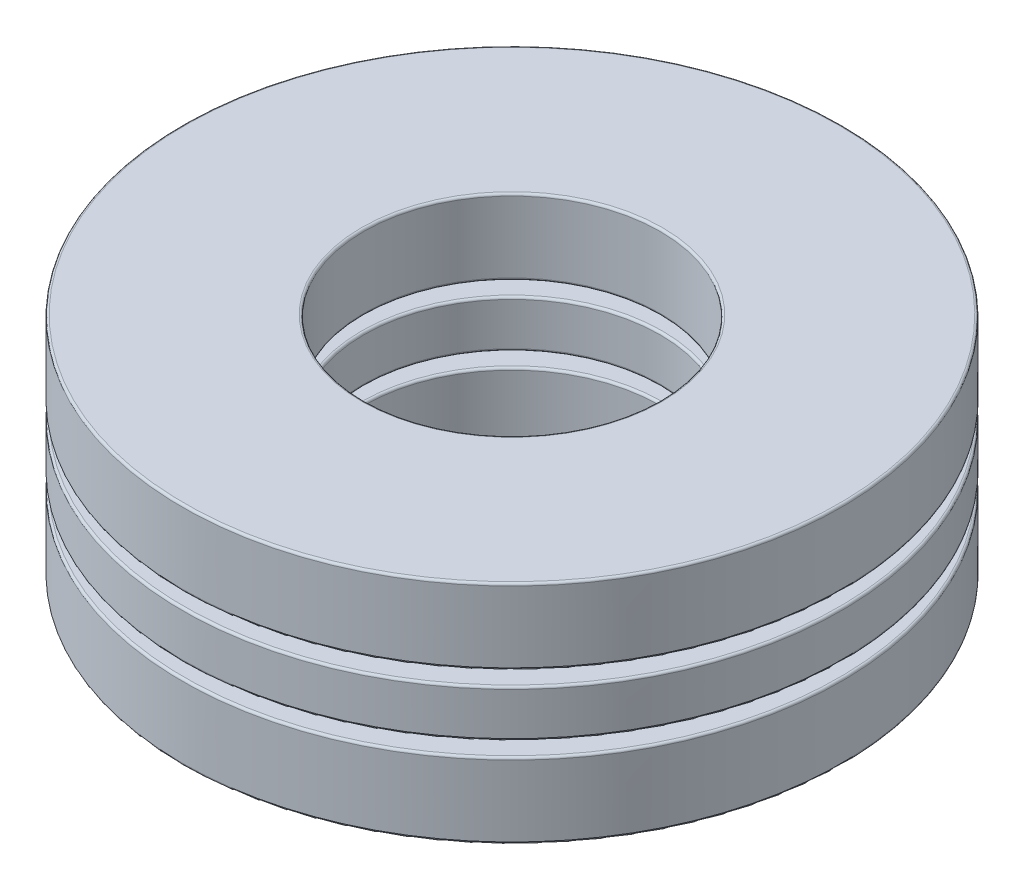
ISO-10303-21;
HEADER;
FILE_DESCRIPTION(('STEP AP214'),'2;1');
FILE_NAME('part.step','',(''),(''),'','','');
FILE_SCHEMA(('AUTOMOTIVE_DESIGN { 1 0 10303 214 1 1 1 1 }'));
ENDSEC;
DATA;
#1=APPLICATION_CONTEXT('core data for automotive mechanical design processes');
#2=APPLICATION_PROTOCOL_DEFINITION('international standard','automotive_design',2000,#1);
#3=PRODUCT_CONTEXT('',#1,'mechanical');
#4=PRODUCT('Part','Part','',(#3));
#5=PRODUCT_RELATED_PRODUCT_CATEGORY('part','',(#4));
#6=PRODUCT_DEFINITION_FORMATION('','',#4);
#7=PRODUCT_DEFINITION_CONTEXT('part definition',#1,'design');
#8=PRODUCT_DEFINITION('design','',#6,#7);
#9=PRODUCT_DEFINITION_SHAPE('','',#8);
#10=(LENGTH_UNIT() NAMED_UNIT(*) SI_UNIT(.MILLI.,.METRE.));
#11=(NAMED_UNIT(*) PLANE_ANGLE_UNIT() SI_UNIT($,.RADIAN.));
#12=(NAMED_UNIT(*) SI_UNIT($,.STERADIAN.) SOLID_ANGLE_UNIT());
#13=UNCERTAINTY_MEASURE_WITH_UNIT(LENGTH_MEASURE(1.E-05),#10,'distance_accuracy_value','');
#14=(GEOMETRIC_REPRESENTATION_CONTEXT(3) GLOBAL_UNCERTAINTY_ASSIGNED_CONTEXT((#13)) GLOBAL_UNIT_ASSIGNED_CONTEXT((#10,
#11,#12)) REPRESENTATION_CONTEXT('',''));
#15=CARTESIAN_POINT('',(0.,0.,0.));
#16=DIRECTION('',(0.,0.,1.));
#17=DIRECTION('',(1.,0.,0.));
#18=AXIS2_PLACEMENT_3D('',#15,#16,#17);
#19=CARTESIAN_POINT('',(0.,-2.4511,0.));
#20=DIRECTION('',(0.,-1.,0.));
#21=DIRECTION('',(0.,0.,-1.));
#22=AXIS2_PLACEMENT_3D('',#19,#20,#21);
#23=CYLINDRICAL_SURFACE('',#22,7.14375);
#24=CARTESIAN_POINT('',(0.,-2.402078,0.));
#25=DIRECTION('',(0.,1.,0.));
#26=DIRECTION('',(0.,0.,1.));
#27=AXIS2_PLACEMENT_3D('',#24,#25,#26);
#28=CIRCLE('',#27,7.14375);
#29=CARTESIAN_POINT('',(0.,-2.402078,7.14375));
#30=VERTEX_POINT('',#29);
#31=EDGE_CURVE('E11',#30,#30,#28,.T.);
#32=ORIENTED_EDGE('',*,*,#31,.T.);
#33=EDGE_LOOP('',(#32));
#34=FACE_BOUND('',#33,.T.);
#35=CARTESIAN_POINT('',(0.,-0.866055333333333,0.));
#36=DIRECTION('',(0.,-1.,0.));
#37=DIRECTION('',(0.,0.,-1.));
#38=AXIS2_PLACEMENT_3D('',#35,#36,#37);
#39=CIRCLE('',#38,7.14375);
#40=CARTESIAN_POINT('',(0.,-0.866055333333333,-7.14375));
#41=VERTEX_POINT('',#40);
#42=EDGE_CURVE('E52',#41,#41,#39,.T.);
#43=ORIENTED_EDGE('',*,*,#42,.T.);
#44=EDGE_LOOP('',(#43));
#45=FACE_BOUND('',#44,.T.);
#46=ADVANCED_FACE('F45',(#34,#45),#23,.T.);
#47=CARTESIAN_POINT('',(0.,-0.817033333333333,7.14375));
#48=DIRECTION('',(0.,-1.,0.));
#49=DIRECTION('',(0.,0.,-1.));
#50=AXIS2_PLACEMENT_3D('',#47,#48,#49);
#51=PLANE('',#50);
#52=CARTESIAN_POINT('',(0.,-0.817033333333333,0.));
#53=DIRECTION('',(0.,-1.,0.));
#54=DIRECTION('',(0.,0.,-1.));
#55=AXIS2_PLACEMENT_3D('',#52,#53,#54);
#56=CIRCLE('',#55,3.262122);
#57=CARTESIAN_POINT('',(0.,-0.817033333333333,-3.262122));
#58=VERTEX_POINT('',#57);
#59=EDGE_CURVE('E56',#58,#58,#56,.T.);
#60=ORIENTED_EDGE('',*,*,#59,.T.);
#61=EDGE_LOOP('',(#60));
#62=FACE_BOUND('',#61,.T.);
#63=CARTESIAN_POINT('',(0.,-0.817033333333333,0.));
#64=DIRECTION('',(0.,-1.,0.));
#65=DIRECTION('',(0.,0.,-1.));
#66=AXIS2_PLACEMENT_3D('',#63,#64,#65);
#67=CIRCLE('',#66,7.094728);
#68=CARTESIAN_POINT('',(0.,-0.817033333333333,-7.094728));
#69=VERTEX_POINT('',#68);
#70=EDGE_CURVE('E60',#69,#69,#67,.F.);
#71=ORIENTED_EDGE('',*,*,#70,.T.);
#72=EDGE_LOOP('',(#71));
#73=FACE_BOUND('',#72,.T.);
#74=ADVANCED_FACE('F88',(#62,#73),#51,.F.);
#75=CARTESIAN_POINT('',(0.,-2.4511,0.));
#76=DIRECTION('',(0.,-1.,0.));
#77=DIRECTION('',(0.,0.,-1.));
#78=AXIS2_PLACEMENT_3D('',#75,#76,#77);
#79=CYLINDRICAL_SURFACE('',#78,3.2131);
#80=CARTESIAN_POINT('',(0.,-2.402078,0.));
#81=DIRECTION('',(0.,1.,0.));
#82=DIRECTION('',(0.,0.,1.));
#83=AXIS2_PLACEMENT_3D('',#80,#81,#82);
#84=CIRCLE('',#83,3.2131);
#85=CARTESIAN_POINT('',(0.,-2.402078,3.2131));
#86=VERTEX_POINT('',#85);
#87=EDGE_CURVE('E71',#86,#86,#84,.F.);
#88=ORIENTED_EDGE('',*,*,#87,.T.);
#89=EDGE_LOOP('',(#88));
#90=FACE_BOUND('',#89,.T.);
#91=CARTESIAN_POINT('',(0.,-0.866055333333333,0.));
#92=DIRECTION('',(0.,-1.,0.));
#93=DIRECTION('',(0.,0.,-1.));
#94=AXIS2_PLACEMENT_3D('',#91,#92,#93);
#95=CIRCLE('',#94,3.2131);
#96=CARTESIAN_POINT('',(0.,-0.866055333333333,-3.2131));
#97=VERTEX_POINT('',#96);
#98=EDGE_CURVE('E74',#97,#97,#95,.F.);
#99=ORIENTED_EDGE('',*,*,#98,.T.);
#100=EDGE_LOOP('',(#99));
#101=FACE_BOUND('',#100,.T.);
#102=ADVANCED_FACE('F78',(#90,#101),#79,.F.);
#103=CARTESIAN_POINT('',(0.,-2.4511,7.14375));
#104=DIRECTION('',(0.,1.,0.));
#105=DIRECTION('',(0.,0.,1.));
#106=AXIS2_PLACEMENT_3D('',#103,#104,#105);
#107=PLANE('',#106);
#108=CARTESIAN_POINT('',(0.,-2.4511,0.));
#109=DIRECTION('',(0.,1.,0.));
#110=DIRECTION('',(0.,0.,1.));
#111=AXIS2_PLACEMENT_3D('',#108,#109,#110);
#112=CIRCLE('',#111,3.262122);
#113=CARTESIAN_POINT('',(0.,-2.4511,3.262122));
#114=VERTEX_POINT('',#113);
#115=EDGE_CURVE('E65',#114,#114,#112,.T.);
#116=ORIENTED_EDGE('',*,*,#115,.T.);
#117=EDGE_LOOP('',(#116));
#118=FACE_BOUND('',#117,.T.);
#119=CARTESIAN_POINT('',(0.,-2.4511,0.));
#120=DIRECTION('',(0.,1.,0.));
#121=DIRECTION('',(0.,0.,1.));
#122=AXIS2_PLACEMENT_3D('',#119,#120,#121);
#123=CIRCLE('',#122,7.094728);
#124=CARTESIAN_POINT('',(0.,-2.4511,7.094728));
#125=VERTEX_POINT('',#124);
#126=EDGE_CURVE('E68',#125,#125,#123,.F.);
#127=ORIENTED_EDGE('',*,*,#126,.T.);
#128=EDGE_LOOP('',(#127));
#129=FACE_BOUND('',#128,.T.);
#130=ADVANCED_FACE('F107',(#118,#129),#107,.F.);
#131=CARTESIAN_POINT('',(0.,-2.402078,0.));
#132=DIRECTION('',(0.,1.,0.));
#133=DIRECTION('',(0.,0.,1.));
#134=AXIS2_PLACEMENT_3D('',#131,#132,#133);
#135=TOROIDAL_SURFACE('',#134,3.262122,0.049022);
#136=ORIENTED_EDGE('',*,*,#115,.F.);
#137=EDGE_LOOP('',(#136));
#138=FACE_BOUND('',#137,.T.);
#139=ORIENTED_EDGE('',*,*,#87,.F.);
#140=EDGE_LOOP('',(#139));
#141=FACE_BOUND('',#140,.T.);
#142=ADVANCED_FACE('F84',(#138,#141),#135,.T.);
#143=CARTESIAN_POINT('',(0.,-0.866055333333333,0.));
#144=DIRECTION('',(0.,-1.,0.));
#145=DIRECTION('',(0.,0.,-1.));
#146=AXIS2_PLACEMENT_3D('',#143,#144,#145);
#147=TOROIDAL_SURFACE('',#146,3.262122,0.049022);
#148=ORIENTED_EDGE('',*,*,#98,.F.);
#149=EDGE_LOOP('',(#148));
#150=FACE_BOUND('',#149,.T.);
#151=ORIENTED_EDGE('',*,*,#59,.F.);
#152=EDGE_LOOP('',(#151));
#153=FACE_BOUND('',#152,.T.);
#154=ADVANCED_FACE('F80',(#150,#153),#147,.T.);
#155=CARTESIAN_POINT('',(0.,-2.402078,0.));
#156=DIRECTION('',(0.,1.,0.));
#157=DIRECTION('',(0.,0.,1.));
#158=AXIS2_PLACEMENT_3D('',#155,#156,#157);
#159=TOROIDAL_SURFACE('',#158,7.094728,0.049022);
#160=ORIENTED_EDGE('',*,*,#31,.F.);
#161=EDGE_LOOP('',(#160));
#162=FACE_BOUND('',#161,.T.);
#163=ORIENTED_EDGE('',*,*,#126,.F.);
#164=EDGE_LOOP('',(#163));
#165=FACE_BOUND('',#164,.T.);
#166=ADVANCED_FACE('F83',(#162,#165),#159,.T.);
#167=CARTESIAN_POINT('',(0.,-0.866055333333333,0.));
#168=DIRECTION('',(0.,-1.,0.));
#169=DIRECTION('',(0.,0.,-1.));
#170=AXIS2_PLACEMENT_3D('',#167,#168,#169);
#171=TOROIDAL_SURFACE('',#170,7.094728,0.049022);
#172=ORIENTED_EDGE('',*,*,#70,.F.);
#173=EDGE_LOOP('',(#172));
#174=FACE_BOUND('',#173,.T.);
#175=ORIENTED_EDGE('',*,*,#42,.F.);
#176=EDGE_LOOP('',(#175));
#177=FACE_BOUND('',#176,.T.);
#178=ADVANCED_FACE('F47',(#174,#177),#171,.T.);
#179=CLOSED_SHELL('',(#46,#74,#102,#130,#142,#154,#166,#178));
#180=MANIFOLD_SOLID_BREP('B2',#179);
#181=CARTESIAN_POINT('',(0.,-2.4511,0.));
#182=DIRECTION('',(0.,-1.,0.));
#183=DIRECTION('',(0.,0.,-1.));
#184=AXIS2_PLACEMENT_3D('',#181,#182,#183);
#185=CYLINDRICAL_SURFACE('',#184,7.14375);
#186=CARTESIAN_POINT('',(0.,0.866055333333334,0.));
#187=DIRECTION('',(0.,1.,0.));
#188=DIRECTION('',(0.,0.,1.));
#189=AXIS2_PLACEMENT_3D('',#186,#187,#188);
#190=CIRCLE('',#189,7.14375);
#191=CARTESIAN_POINT('',(0.,0.866055333333334,7.14375));
#192=VERTEX_POINT('',#191);
#193=EDGE_CURVE('E44',#192,#192,#190,.T.);
#194=ORIENTED_EDGE('',*,*,#193,.T.);
#195=EDGE_LOOP('',(#194));
#196=FACE_BOUND('',#195,.T.);
#197=CARTESIAN_POINT('',(0.,2.402078,0.));
#198=DIRECTION('',(0.,-1.,0.));
#199=DIRECTION('',(0.,0.,-1.));
#200=AXIS2_PLACEMENT_3D('',#197,#198,#199);
#201=CIRCLE('',#200,7.14375);
#202=CARTESIAN_POINT('',(0.,2.402078,-7.14375));
#203=VERTEX_POINT('',#202);
#204=EDGE_CURVE('E179',#203,#203,#201,.T.);
#205=ORIENTED_EDGE('',*,*,#204,.T.);
#206=EDGE_LOOP('',(#205));
#207=FACE_BOUND('',#206,.T.);
#208=ADVANCED_FACE('F172',(#196,#207),#185,.T.);
#209=CARTESIAN_POINT('',(0.,2.4511,7.14375));
#210=DIRECTION('',(0.,-1.,0.));
#211=DIRECTION('',(0.,0.,-1.));
#212=AXIS2_PLACEMENT_3D('',#209,#210,#211);
#213=PLANE('',#212);
#214=CARTESIAN_POINT('',(0.,2.4511,0.));
#215=DIRECTION('',(0.,-1.,0.));
#216=DIRECTION('',(0.,0.,-1.));
#217=AXIS2_PLACEMENT_3D('',#214,#215,#216);
#218=CIRCLE('',#217,3.262122);
#219=CARTESIAN_POINT('',(0.,2.4511,-3.262122));
#220=VERTEX_POINT('',#219);
#221=EDGE_CURVE('E183',#220,#220,#218,.T.);
#222=ORIENTED_EDGE('',*,*,#221,.T.);
#223=EDGE_LOOP('',(#222));
#224=FACE_BOUND('',#223,.T.);
#225=CARTESIAN_POINT('',(0.,2.4511,0.));
#226=DIRECTION('',(0.,-1.,0.));
#227=DIRECTION('',(0.,0.,-1.));
#228=AXIS2_PLACEMENT_3D('',#225,#226,#227);
#229=CIRCLE('',#228,7.094728);
#230=CARTESIAN_POINT('',(0.,2.4511,-7.094728));
#231=VERTEX_POINT('',#230);
#232=EDGE_CURVE('E187',#231,#231,#229,.F.);
#233=ORIENTED_EDGE('',*,*,#232,.T.);
#234=EDGE_LOOP('',(#233));
#235=FACE_BOUND('',#234,.T.);
#236=ADVANCED_FACE('F215',(#224,#235),#213,.F.);
#237=CARTESIAN_POINT('',(0.,-2.4511,0.));
#238=DIRECTION('',(0.,-1.,0.));
#239=DIRECTION('',(0.,0.,-1.));
#240=AXIS2_PLACEMENT_3D('',#237,#238,#239);
#241=CYLINDRICAL_SURFACE('',#240,3.2131);
#242=CARTESIAN_POINT('',(0.,0.866055333333334,0.));
#243=DIRECTION('',(0.,1.,0.));
#244=DIRECTION('',(0.,0.,1.));
#245=AXIS2_PLACEMENT_3D('',#242,#243,#244);
#246=CIRCLE('',#245,3.2131);
#247=CARTESIAN_POINT('',(0.,0.866055333333334,3.2131));
#248=VERTEX_POINT('',#247);
#249=EDGE_CURVE('E198',#248,#248,#246,.F.);
#250=ORIENTED_EDGE('',*,*,#249,.T.);
#251=EDGE_LOOP('',(#250));
#252=FACE_BOUND('',#251,.T.);
#253=CARTESIAN_POINT('',(0.,2.402078,0.));
#254=DIRECTION('',(0.,-1.,0.));
#255=DIRECTION('',(0.,0.,-1.));
#256=AXIS2_PLACEMENT_3D('',#253,#254,#255);
#257=CIRCLE('',#256,3.2131);
#258=CARTESIAN_POINT('',(0.,2.402078,-3.2131));
#259=VERTEX_POINT('',#258);
#260=EDGE_CURVE('E201',#259,#259,#257,.F.);
#261=ORIENTED_EDGE('',*,*,#260,.T.);
#262=EDGE_LOOP('',(#261));
#263=FACE_BOUND('',#262,.T.);
#264=ADVANCED_FACE('F205',(#252,#263),#241,.F.);
#265=CARTESIAN_POINT('',(0.,0.817033333333334,7.14375));
#266=DIRECTION('',(0.,1.,0.));
#267=DIRECTION('',(0.,0.,1.));
#268=AXIS2_PLACEMENT_3D('',#265,#266,#267);
#269=PLANE('',#268);
#270=CARTESIAN_POINT('',(0.,0.817033333333334,0.));
#271=DIRECTION('',(0.,1.,0.));
#272=DIRECTION('',(0.,0.,1.));
#273=AXIS2_PLACEMENT_3D('',#270,#271,#272);
#274=CIRCLE('',#273,3.262122);
#275=CARTESIAN_POINT('',(0.,0.817033333333334,3.262122));
#276=VERTEX_POINT('',#275);
#277=EDGE_CURVE('E192',#276,#276,#274,.T.);
#278=ORIENTED_EDGE('',*,*,#277,.T.);
#279=EDGE_LOOP('',(#278));
#280=FACE_BOUND('',#279,.T.);
#281=CARTESIAN_POINT('',(0.,0.817033333333334,0.));
#282=DIRECTION('',(0.,1.,0.));
#283=DIRECTION('',(0.,0.,1.));
#284=AXIS2_PLACEMENT_3D('',#281,#282,#283);
#285=CIRCLE('',#284,7.094728);
#286=CARTESIAN_POINT('',(0.,0.817033333333334,7.094728));
#287=VERTEX_POINT('',#286);
#288=EDGE_CURVE('E195',#287,#287,#285,.F.);
#289=ORIENTED_EDGE('',*,*,#288,.T.);
#290=EDGE_LOOP('',(#289));
#291=FACE_BOUND('',#290,.T.);
#292=ADVANCED_FACE('F234',(#280,#291),#269,.F.);
#293=CARTESIAN_POINT('',(0.,0.866055333333334,0.));
#294=DIRECTION('',(0.,1.,0.));
#295=DIRECTION('',(0.,0.,1.));
#296=AXIS2_PLACEMENT_3D('',#293,#294,#295);
#297=TOROIDAL_SURFACE('',#296,3.262122,0.049022);
#298=ORIENTED_EDGE('',*,*,#277,.F.);
#299=EDGE_LOOP('',(#298));
#300=FACE_BOUND('',#299,.T.);
#301=ORIENTED_EDGE('',*,*,#249,.F.);
#302=EDGE_LOOP('',(#301));
#303=FACE_BOUND('',#302,.T.);
#304=ADVANCED_FACE('F211',(#300,#303),#297,.T.);
#305=CARTESIAN_POINT('',(0.,2.402078,0.));
#306=DIRECTION('',(0.,-1.,0.));
#307=DIRECTION('',(0.,0.,-1.));
#308=AXIS2_PLACEMENT_3D('',#305,#306,#307);
#309=TOROIDAL_SURFACE('',#308,3.262122,0.049022);
#310=ORIENTED_EDGE('',*,*,#260,.F.);
#311=EDGE_LOOP('',(#310));
#312=FACE_BOUND('',#311,.T.);
#313=ORIENTED_EDGE('',*,*,#221,.F.);
#314=EDGE_LOOP('',(#313));
#315=FACE_BOUND('',#314,.T.);
#316=ADVANCED_FACE('F207',(#312,#315),#309,.T.);
#317=CARTESIAN_POINT('',(0.,0.866055333333334,0.));
#318=DIRECTION('',(0.,1.,0.));
#319=DIRECTION('',(0.,0.,1.));
#320=AXIS2_PLACEMENT_3D('',#317,#318,#319);
#321=TOROIDAL_SURFACE('',#320,7.094728,0.049022);
#322=ORIENTED_EDGE('',*,*,#193,.F.);
#323=EDGE_LOOP('',(#322));
#324=FACE_BOUND('',#323,.T.);
#325=ORIENTED_EDGE('',*,*,#288,.F.);
#326=EDGE_LOOP('',(#325));
#327=FACE_BOUND('',#326,.T.);
#328=ADVANCED_FACE('F210',(#324,#327),#321,.T.);
#329=CARTESIAN_POINT('',(0.,2.402078,0.));
#330=DIRECTION('',(0.,-1.,0.));
#331=DIRECTION('',(0.,0.,-1.));
#332=AXIS2_PLACEMENT_3D('',#329,#330,#331);
#333=TOROIDAL_SURFACE('',#332,7.094728,0.049022);
#334=ORIENTED_EDGE('',*,*,#232,.F.);
#335=EDGE_LOOP('',(#334));
#336=FACE_BOUND('',#335,.T.);
#337=ORIENTED_EDGE('',*,*,#204,.F.);
#338=EDGE_LOOP('',(#337));
#339=FACE_BOUND('',#338,.T.);
#340=ADVANCED_FACE('F174',(#336,#339),#333,.T.);
#341=CLOSED_SHELL('',(#208,#236,#264,#292,#304,#316,#328,#340));
#342=MANIFOLD_SOLID_BREP('B6',#341);
#343=CARTESIAN_POINT('',(-4.48464760159246,0.,-2.58921249999996));
#344=DIRECTION('',(0.,1.,0.));
#345=DIRECTION('',(0.866025403784443,0.,0.499999999999992));
#346=AXIS2_PLACEMENT_3D('',#343,#344,#345);
#347=SPHERICAL_SURFACE('',#346,0.817033333333333);
#348=CARTESIAN_POINT('',(-4.48464760159246,0.817033333333333,-2.58921249999996));
#349=VERTEX_POINT('',#348);
#350=VERTEX_LOOP('',#349);
#351=FACE_BOUND('',#350,.T.);
#352=ADVANCED_FACE('F299',(#351),#347,.T.);
#353=CLOSED_SHELL('',(#352));
#354=MANIFOLD_SOLID_BREP('B39',#353);
#355=CARTESIAN_POINT('',(4.48464760159242,0.,-2.58921250000002));
#356=DIRECTION('',(0.,1.,0.));
#357=DIRECTION('',(-0.866025403784436,0.,0.500000000000004));
#358=AXIS2_PLACEMENT_3D('',#355,#356,#357);
#359=SPHERICAL_SURFACE('',#358,0.817033333333333);
#360=CARTESIAN_POINT('',(4.48464760159242,0.817033333333333,-2.58921250000002));
#361=VERTEX_POINT('',#360);
#362=VERTEX_LOOP('',#361);
#363=FACE_BOUND('',#362,.T.);
#364=ADVANCED_FACE('F317',(#363),#359,.T.);
#365=CLOSED_SHELL('',(#364));
#366=MANIFOLD_SOLID_BREP('B168',#365);
#367=CARTESIAN_POINT('',(0.,0.,5.178425));
#368=DIRECTION('',(0.,1.,0.));
#369=DIRECTION('',(0.,0.,-1.));
#370=AXIS2_PLACEMENT_3D('',#367,#368,#369);
#371=SPHERICAL_SURFACE('',#370,0.817033333333333);
#372=CARTESIAN_POINT('',(0.,0.817033333333333,5.178425));
#373=VERTEX_POINT('',#372);
#374=VERTEX_LOOP('',#373);
#375=FACE_BOUND('',#374,.T.);
#376=ADVANCED_FACE('F336',(#375),#371,.T.);
#377=CLOSED_SHELL('',(#376));
#378=MANIFOLD_SOLID_BREP('B295',#377);
#379=CARTESIAN_POINT('',(0.,-2.4511,0.));
#380=DIRECTION('',(0.,-1.,0.));
#381=DIRECTION('',(0.,0.,-1.));
#382=AXIS2_PLACEMENT_3D('',#379,#380,#381);
#383=CYLINDRICAL_SURFACE('',#382,7.14375);
#384=CARTESIAN_POINT('',(0.,-0.461623833333335,0.));
#385=DIRECTION('',(0.,1.,0.));
#386=DIRECTION('',(0.,0.,1.));
#387=AXIS2_PLACEMENT_3D('',#384,#385,#386);
#388=CIRCLE('',#387,7.14375);
#389=CARTESIAN_POINT('',(0.,-0.461623833333335,7.14375));
#390=VERTEX_POINT('',#389);
#391=EDGE_CURVE('E335',#390,#390,#388,.T.);
#392=ORIENTED_EDGE('',*,*,#391,.T.);
#393=EDGE_LOOP('',(#392));
#394=FACE_BOUND('',#393,.T.);
#395=CARTESIAN_POINT('',(0.,0.461623833333332,0.));
#396=DIRECTION('',(0.,-1.,0.));
#397=DIRECTION('',(0.,0.,-1.));
#398=AXIS2_PLACEMENT_3D('',#395,#396,#397);
#399=CIRCLE('',#398,7.14375);
#400=CARTESIAN_POINT('',(0.,0.461623833333332,-7.14375));
#401=VERTEX_POINT('',#400);
#402=EDGE_CURVE('E355',#401,#401,#399,.T.);
#403=ORIENTED_EDGE('',*,*,#402,.T.);
#404=EDGE_LOOP('',(#403));
#405=FACE_BOUND('',#404,.T.);
#406=ADVANCED_FACE('F348',(#394,#405),#383,.T.);
#407=CARTESIAN_POINT('',(0.,-0.510645833333335,7.14375));
#408=DIRECTION('',(0.,1.,0.));
#409=DIRECTION('',(0.,0.,1.));
#410=AXIS2_PLACEMENT_3D('',#407,#408,#409);
#411=PLANE('',#410);
#412=CARTESIAN_POINT('',(0.,-0.510645833333335,0.));
#413=DIRECTION('',(0.,1.,0.));
#414=DIRECTION('',(0.,0.,1.));
#415=AXIS2_PLACEMENT_3D('',#412,#413,#414);
#416=CIRCLE('',#415,3.262122);
#417=CARTESIAN_POINT('',(0.,-0.510645833333335,3.262122));
#418=VERTEX_POINT('',#417);
#419=EDGE_CURVE('E368',#418,#418,#416,.T.);
#420=ORIENTED_EDGE('',*,*,#419,.T.);
#421=EDGE_LOOP('',(#420));
#422=FACE_BOUND('',#421,.T.);
#423=CARTESIAN_POINT('',(0.,-0.510645833333335,0.));
#424=DIRECTION('',(0.,1.,0.));
#425=DIRECTION('',(0.,0.,1.));
#426=AXIS2_PLACEMENT_3D('',#423,#424,#425);
#427=CIRCLE('',#426,7.094728);
#428=CARTESIAN_POINT('',(0.,-0.510645833333335,7.094728));
#429=VERTEX_POINT('',#428);
#430=EDGE_CURVE('E371',#429,#429,#427,.F.);
#431=ORIENTED_EDGE('',*,*,#430,.T.);
#432=EDGE_LOOP('',(#431));
#433=FACE_BOUND('',#432,.T.);
#434=CARTESIAN_POINT('',(-4.48464760159246,-0.510645833333335,-2.58921249999996));
#435=DIRECTION('',(0.,1.,0.));
#436=DIRECTION('',(-0.866025403784443,0.,-0.499999999999992));
#437=AXIS2_PLACEMENT_3D('',#434,#435,#436);
#438=CIRCLE('',#437,0.637796441411429);
#439=CARTESIAN_POINT('',(-3.93229968088684,-0.510645833333335,-2.27031427929425));
#440=VERTEX_POINT('',#439);
#441=EDGE_CURVE('E392',#440,#440,#438,.T.);
#442=ORIENTED_EDGE('',*,*,#441,.T.);
#443=EDGE_LOOP('',(#442));
#444=FACE_BOUND('',#443,.T.);
#445=CARTESIAN_POINT('',(4.48464760159242,-0.510645833333335,-2.58921250000002));
#446=DIRECTION('',(0.,1.,0.));
#447=DIRECTION('',(0.866025403784436,0.,-0.500000000000004));
#448=AXIS2_PLACEMENT_3D('',#445,#446,#447);
#449=CIRCLE('',#448,0.637796441411429);
#450=CARTESIAN_POINT('',(3.93229968088681,-0.510645833333335,-2.2703142792943));
#451=VERTEX_POINT('',#450);
#452=EDGE_CURVE('E384',#451,#451,#449,.T.);
#453=ORIENTED_EDGE('',*,*,#452,.T.);
#454=EDGE_LOOP('',(#453));
#455=FACE_BOUND('',#454,.T.);
#456=CARTESIAN_POINT('',(0.,-0.510645833333335,5.178425));
#457=DIRECTION('',(0.,1.,0.));
#458=DIRECTION('',(0.,0.,1.));
#459=AXIS2_PLACEMENT_3D('',#456,#457,#458);
#460=CIRCLE('',#459,0.637796441411429);
#461=CARTESIAN_POINT('',(0.,-0.510645833333335,4.54062855858857));
#462=VERTEX_POINT('',#461);
#463=EDGE_CURVE('E380',#462,#462,#460,.T.);
#464=ORIENTED_EDGE('',*,*,#463,.T.);
#465=EDGE_LOOP('',(#464));
#466=FACE_BOUND('',#465,.T.);
#467=ADVANCED_FACE('F410',(#422,#433,#444,#455,#466),#411,.F.);
#468=CARTESIAN_POINT('',(0.,-2.4511,0.));
#469=DIRECTION('',(0.,-1.,0.));
#470=DIRECTION('',(0.,0.,-1.));
#471=AXIS2_PLACEMENT_3D('',#468,#469,#470);
#472=CYLINDRICAL_SURFACE('',#471,3.2131);
#473=CARTESIAN_POINT('',(0.,-0.461623833333335,0.));
#474=DIRECTION('',(0.,1.,0.));
#475=DIRECTION('',(0.,0.,1.));
#476=AXIS2_PLACEMENT_3D('',#473,#474,#475);
#477=CIRCLE('',#476,3.2131);
#478=CARTESIAN_POINT('',(0.,-0.461623833333335,3.2131));
#479=VERTEX_POINT('',#478);
#480=EDGE_CURVE('E374',#479,#479,#477,.F.);
#481=ORIENTED_EDGE('',*,*,#480,.T.);
#482=EDGE_LOOP('',(#481));
#483=FACE_BOUND('',#482,.T.);
#484=CARTESIAN_POINT('',(0.,0.461623833333332,0.));
#485=DIRECTION('',(0.,-1.,0.));
#486=DIRECTION('',(0.,0.,-1.));
#487=AXIS2_PLACEMENT_3D('',#484,#485,#486);
#488=CIRCLE('',#487,3.2131);
#489=CARTESIAN_POINT('',(0.,0.461623833333332,-3.2131));
#490=VERTEX_POINT('',#489);
#491=EDGE_CURVE('E377',#490,#490,#488,.F.);
#492=ORIENTED_EDGE('',*,*,#491,.T.);
#493=EDGE_LOOP('',(#492));
#494=FACE_BOUND('',#493,.T.);
#495=ADVANCED_FACE('F413',(#483,#494),#472,.F.);
#496=CARTESIAN_POINT('',(0.,0.510645833333332,7.14375));
#497=DIRECTION('',(0.,-1.,0.));
#498=DIRECTION('',(0.,0.,-1.));
#499=AXIS2_PLACEMENT_3D('',#496,#497,#498);
#500=PLANE('',#499);
#501=CARTESIAN_POINT('',(0.,0.510645833333332,0.));
#502=DIRECTION('',(0.,-1.,0.));
#503=DIRECTION('',(0.,0.,-1.));
#504=AXIS2_PLACEMENT_3D('',#501,#502,#503);
#505=CIRCLE('',#504,3.262122);
#506=CARTESIAN_POINT('',(0.,0.510645833333332,-3.262122));
#507=VERTEX_POINT('',#506);
#508=EDGE_CURVE('E359',#507,#507,#505,.T.);
#509=ORIENTED_EDGE('',*,*,#508,.T.);
#510=EDGE_LOOP('',(#509));
#511=FACE_BOUND('',#510,.T.);
#512=CARTESIAN_POINT('',(0.,0.510645833333332,0.));
#513=DIRECTION('',(0.,-1.,0.));
#514=DIRECTION('',(0.,0.,-1.));
#515=AXIS2_PLACEMENT_3D('',#512,#513,#514);
#516=CIRCLE('',#515,7.094728);
#517=CARTESIAN_POINT('',(0.,0.510645833333332,-7.094728));
#518=VERTEX_POINT('',#517);
#519=EDGE_CURVE('E363',#518,#518,#516,.F.);
#520=ORIENTED_EDGE('',*,*,#519,.T.);
#521=EDGE_LOOP('',(#520));
#522=FACE_BOUND('',#521,.T.);
#523=CARTESIAN_POINT('',(-4.48464760159246,0.510645833333332,-2.58921249999996));
#524=DIRECTION('',(0.,-1.,0.));
#525=DIRECTION('',(0.866025403784443,0.,0.499999999999992));
#526=AXIS2_PLACEMENT_3D('',#523,#524,#525);
#527=CIRCLE('',#526,0.637796441411431);
#528=CARTESIAN_POINT('',(-3.93229968088684,0.510645833333332,-2.27031427929425));
#529=VERTEX_POINT('',#528);
#530=EDGE_CURVE('E395',#529,#529,#527,.T.);
#531=ORIENTED_EDGE('',*,*,#530,.T.);
#532=EDGE_LOOP('',(#531));
#533=FACE_BOUND('',#532,.T.);
#534=CARTESIAN_POINT('',(4.48464760159242,0.510645833333332,-2.58921250000002));
#535=DIRECTION('',(0.,-1.,0.));
#536=DIRECTION('',(-0.866025403784436,0.,0.500000000000004));
#537=AXIS2_PLACEMENT_3D('',#534,#535,#536);
#538=CIRCLE('',#537,0.637796441411431);
#539=CARTESIAN_POINT('',(3.93229968088681,0.510645833333332,-2.2703142792943));
#540=VERTEX_POINT('',#539);
#541=EDGE_CURVE('E389',#540,#540,#538,.T.);
#542=ORIENTED_EDGE('',*,*,#541,.T.);
#543=EDGE_LOOP('',(#542));
#544=FACE_BOUND('',#543,.T.);
#545=CARTESIAN_POINT('',(0.,0.510645833333332,5.178425));
#546=DIRECTION('',(0.,-1.,0.));
#547=DIRECTION('',(0.,0.,-1.));
#548=AXIS2_PLACEMENT_3D('',#545,#546,#547);
#549=CIRCLE('',#548,0.637796441411431);
#550=CARTESIAN_POINT('',(0.,0.510645833333332,4.54062855858857));
#551=VERTEX_POINT('',#550);
#552=EDGE_CURVE('E381',#551,#551,#549,.T.);
#553=ORIENTED_EDGE('',*,*,#552,.T.);
#554=EDGE_LOOP('',(#553));
#555=FACE_BOUND('',#554,.T.);
#556=ADVANCED_FACE('F399',(#511,#522,#533,#544,#555),#500,.F.);
#557=CARTESIAN_POINT('',(0.,0.,5.178425));
#558=DIRECTION('',(0.,1.,0.));
#559=DIRECTION('',(0.,0.,-1.));
#560=AXIS2_PLACEMENT_3D('',#557,#558,#559);
#561=SPHERICAL_SURFACE('',#560,0.817033333333333);
#562=CARTESIAN_POINT('',(0.,0.510645833333332,4.54062855858857));
#563=CARTESIAN_POINT('',(0.,0.501675164998558,4.53344607738196));
#564=CARTESIAN_POINT('',(0.,0.492552783000895,4.52645310460206));
#565=CARTESIAN_POINT('',(0.,0.474021234127414,4.5128580760368));
#566=CARTESIAN_POINT('',(0.,0.464612067251596,4.50625602025143));
#567=CARTESIAN_POINT('',(0.,0.445523591069434,4.49345472581636));
#568=CARTESIAN_POINT('',(0.,0.435844281763088,4.48725548716666));
#569=CARTESIAN_POINT('',(0.,0.41623278087744,4.47527082357285));
#570=CARTESIAN_POINT('',(0.,0.406300589298138,4.46948539862875));
#571=CARTESIAN_POINT('',(0.,0.386200997553858,4.45833867230342));
#572=CARTESIAN_POINT('',(0.,0.376033597388881,4.45297737092218));
#573=CARTESIAN_POINT('',(0.,0.355481690704,4.44268843316086));
#574=CARTESIAN_POINT('',(0.,0.345097184184096,4.43776079678078));
#575=CARTESIAN_POINT('',(0.,0.324129550884321,4.42834796203054));
#576=CARTESIAN_POINT('',(0.,0.31354642410445,4.42386276366039));
#577=CARTESIAN_POINT('',(0.,0.292200390671569,4.41534278934294));
#578=CARTESIAN_POINT('',(0.,0.28143748401856,4.41130801339564));
#579=CARTESIAN_POINT('',(0.,0.259751051084056,4.40369606674576));
#580=CARTESIAN_POINT('',(0.,0.248827524802562,4.40011889604317));
#581=CARTESIAN_POINT('',(0.,0.226839298843794,4.39342852799998));
#582=CARTESIAN_POINT('',(0.,0.215774599166519,4.39031533065938));
#583=CARTESIAN_POINT('',(0.,0.193523723954283,4.3845584515037));
#584=CARTESIAN_POINT('',(0.,0.18233754841932,4.38191476968864));
#585=CARTESIAN_POINT('',(0.,0.159863635286542,4.37710162790421));
#586=CARTESIAN_POINT('',(0.,0.148575897688727,4.37493216793485));
#587=CARTESIAN_POINT('',(0.,0.125918955026379,4.37107133194664));
#588=CARTESIAN_POINT('',(0.,0.114549749961847,4.3693799559278));
#589=CARTESIAN_POINT('',(0.,0.0917501119920463,4.36647829885297));
#590=CARTESIAN_POINT('',(0.,0.0803196790867774,4.36526801779699));
#591=CARTESIAN_POINT('',(0.,0.057417934060114,4.36333070520805));
#592=CARTESIAN_POINT('',(0.,0.0459466219387195,4.36260367367509));
#593=CARTESIAN_POINT('',(0.,0.0229835398782162,4.3616341544044));
#594=CARTESIAN_POINT('',(0.,0.0114917699391074,4.36139166666667));
#595=CARTESIAN_POINT('',(0.,-0.0114917699391103,4.36139166666667));
#596=CARTESIAN_POINT('',(0.,-0.0229835398782191,4.3616341544044));
#597=CARTESIAN_POINT('',(0.,-0.0459466219387224,4.36260367367509));
#598=CARTESIAN_POINT('',(0.,-0.0574179340601168,4.36333070520805));
#599=CARTESIAN_POINT('',(0.,-0.0803196790867803,4.36526801779699));
#600=CARTESIAN_POINT('',(0.,-0.0917501119920492,4.36647829885297));
#601=CARTESIAN_POINT('',(0.,-0.11454974996185,4.3693799559278));
#602=CARTESIAN_POINT('',(0.,-0.125918955026382,4.37107133194665));
#603=CARTESIAN_POINT('',(0.,-0.14857589768873,4.37493216793485));
#604=CARTESIAN_POINT('',(0.,-0.159863635286545,4.37710162790421));
#605=CARTESIAN_POINT('',(0.,-0.182337548419323,4.38191476968864));
#606=CARTESIAN_POINT('',(0.,-0.193523723954285,4.3845584515037));
#607=CARTESIAN_POINT('',(0.,-0.215774599166522,4.39031533065938));
#608=CARTESIAN_POINT('',(0.,-0.226839298843796,4.39342852799998));
#609=CARTESIAN_POINT('',(0.,-0.248827524802565,4.40011889604318));
#610=CARTESIAN_POINT('',(0.,-0.259751051084059,4.40369606674576));
#611=CARTESIAN_POINT('',(0.,-0.281437484018563,4.41130801339565));
#612=CARTESIAN_POINT('',(0.,-0.292200390671572,4.41534278934294));
#613=CARTESIAN_POINT('',(0.,-0.313546424104452,4.42386276366039));
#614=CARTESIAN_POINT('',(0.,-0.324129550884324,4.42834796203054));
#615=CARTESIAN_POINT('',(0.,-0.345097184184099,4.43776079678078));
#616=CARTESIAN_POINT('',(0.,-0.355481690704003,4.44268843316086));
#617=CARTESIAN_POINT('',(0.,-0.376033597388883,4.45297737092218));
#618=CARTESIAN_POINT('',(0.,-0.386200997553861,4.45833867230342));
#619=CARTESIAN_POINT('',(0.,-0.40630058929814,4.46948539862875));
#620=CARTESIAN_POINT('',(0.,-0.416232780877443,4.47527082357285));
#621=CARTESIAN_POINT('',(0.,-0.435844281763091,4.48725548716666));
#622=CARTESIAN_POINT('',(0.,-0.445523591069436,4.49345472581636));
#623=CARTESIAN_POINT('',(0.,-0.464612067251599,4.50625602025144));
#624=CARTESIAN_POINT('',(0.,-0.474021234127416,4.5128580760368));
#625=CARTESIAN_POINT('',(0.,-0.492552783000897,4.52645310460206));
#626=CARTESIAN_POINT('',(0.,-0.501675164998561,4.53344607738196));
#627=CARTESIAN_POINT('',(0.,-0.510645833333335,4.54062855858857));
#628=B_SPLINE_CURVE_WITH_KNOTS('',3,(#562,#563,#564,#565,#566,#567,#568,#569,#570,#571,#572,
#573,#574,#575,#576,#577,#578,#579,#580,#581,#582,#583,#584,#585,#586,#587,#588,#589,#590,#591,
#592,#593,#594,#595,#596,#597,#598,#599,#600,#601,#602,#603,#604,#605,#606,#607,#608,#609,#610,
#611,#612,#613,#614,#615,#616,#617,#618,#619,#620,#621,#622,#623,#624,#625,#626,#627),
.UNSPECIFIED.,.F.,.F.,(4,2,2,2,2,2,2,2,2,2,2,2,2,2,2,2,2,2,2,2,2,2,2,2,2,2,2,2,2,2,2,2,4),(0.,
0.0344727528748284,0.0689455057496569,0.103418258624485,0.137891011499313,0.172363764374141,
0.20683651724897,0.241309270123798,0.275782022998627,0.310254775873455,0.344727528748283,
0.379200281623111,0.41367303449794,0.448145787372768,0.482618540247596,0.517091293122424,
0.551564045997253,0.586036798872081,0.620509551746909,0.654982304621737,0.689455057496566,
0.723927810371394,0.758400563246222,0.792873316121051,0.827346068995879,0.861818821870707,
0.896291574745535,0.930764327620364,0.965237080495192,0.99970983337002,1.03418258624485,
1.06865533911968,1.10312809199451),.UNSPECIFIED.);
#629=EDGE_CURVE('BSEAM420',#551,#462,#628,.T.);
#630=ORIENTED_EDGE('',*,*,#552,.F.);
#631=ORIENTED_EDGE('',*,*,#463,.F.);
#632=ORIENTED_EDGE('',*,*,#629,.T.);
#633=ORIENTED_EDGE('',*,*,#629,.F.);
#634=EDGE_LOOP('',(#630,#632,#631,#633));
#635=FACE_BOUND('',#634,.T.);
#636=ADVANCED_FACE('F420',(#635),#561,.F.);
#637=CARTESIAN_POINT('',(4.48464760159242,0.,-2.58921250000002));
#638=DIRECTION('',(0.,1.,0.));
#639=DIRECTION('',(-0.866025403784436,0.,0.500000000000004));
#640=AXIS2_PLACEMENT_3D('',#637,#638,#639);
#641=SPHERICAL_SURFACE('',#640,0.817033333333333);
#642=CARTESIAN_POINT('',(3.93229968088681,0.510645833333332,-2.2703142792943));
#643=CARTESIAN_POINT('',(3.92607946969968,0.501675164998559,-2.266723038691));
#644=CARTESIAN_POINT('',(3.92002337762431,0.492552783000895,-2.26322655230105));
#645=CARTESIAN_POINT('',(3.90824973752162,0.474021234127414,-2.25642903801842));
#646=CARTESIAN_POINT('',(3.9025321894943,0.464612067251596,-2.25312801012574));
#647=CARTESIAN_POINT('',(3.8914459433122,0.445523591069434,-2.2467273629082));
#648=CARTESIAN_POINT('',(3.88607724515743,0.435844281763088,-2.24362774358335));
#649=CARTESIAN_POINT('',(3.87569822202938,0.41623278087744,-2.23763541178644));
#650=CARTESIAN_POINT('',(3.87068789705611,0.406300589298138,-2.23474269931439));
#651=CARTESIAN_POINT('',(3.86103454888933,0.386200997553858,-2.22916933615173));
#652=CARTESIAN_POINT('',(3.85639152569584,0.376033597388881,-2.22648868546111));
#653=CARTESIAN_POINT('',(3.84748104421658,0.355481690704,-2.22134421658045));
#654=CARTESIAN_POINT('',(3.84321358593081,0.345097184184096,-2.21888039839041));
#655=CARTESIAN_POINT('',(3.83506183191549,0.324129550884321,-2.21417398101529));
#656=CARTESIAN_POINT('',(3.83117753618592,0.31354642410445,-2.21193138183021));
#657=CARTESIAN_POINT('',(3.82379902198742,0.292200390671569,-2.20767139467149));
#658=CARTESIAN_POINT('',(3.82030480351848,0.28143748401856,-2.20565400669784));
#659=CARTESIAN_POINT('',(3.81371266434743,0.259751051084056,-2.2018480333729));
#660=CARTESIAN_POINT('',(3.81061474364532,0.248827524802562,-2.20005944802161));
#661=CARTESIAN_POINT('',(3.80482071495925,0.226839298843794,-2.19671426400001));
#662=CARTESIAN_POINT('',(3.80212460697529,0.215774599166519,-2.19515766532971));
#663=CARTESIAN_POINT('',(3.79713900337996,0.193523723954282,-2.19227922575187));
#664=CARTESIAN_POINT('',(3.79484950776859,0.18233754841932,-2.19095738484434));
#665=CARTESIAN_POINT('',(3.79068120471126,0.159863635286543,-2.18855081395212));
#666=CARTESIAN_POINT('',(3.7888023972653,0.148575897688727,-2.18746608396745));
#667=CARTESIAN_POINT('',(3.78545881521967,0.125918955026379,-2.18553566597334));
#668=CARTESIAN_POINT('',(3.78399404061999,0.114549749961847,-2.18468997796392));
#669=CARTESIAN_POINT('',(3.78148113188012,0.0917501119920463,-2.1832391494265));
#670=CARTESIAN_POINT('',(3.78043299773993,0.0803196790867774,-2.18263400889851));
#671=CARTESIAN_POINT('',(3.77875523582283,0.0574179340601139,-2.18166535260404));
#672=CARTESIAN_POINT('',(3.77812560804594,0.0459466219387195,-2.18130183683756));
#673=CARTESIAN_POINT('',(3.77728597972806,0.0229835398782162,-2.18081707720222));
#674=CARTESIAN_POINT('',(3.77707597918708,0.0114917699391074,-2.18069583333335));
#675=CARTESIAN_POINT('',(3.77707597918708,-0.0114917699391103,-2.18069583333335));
#676=CARTESIAN_POINT('',(3.77728597972806,-0.0229835398782191,-2.18081707720222));
#677=CARTESIAN_POINT('',(3.77812560804594,-0.0459466219387224,-2.18130183683756));
#678=CARTESIAN_POINT('',(3.77875523582283,-0.0574179340601169,-2.18166535260404));
#679=CARTESIAN_POINT('',(3.78043299773993,-0.0803196790867803,-2.18263400889851));
#680=CARTESIAN_POINT('',(3.78148113188012,-0.0917501119920492,-2.1832391494265));
#681=CARTESIAN_POINT('',(3.78399404061999,-0.11454974996185,-2.18468997796392));
#682=CARTESIAN_POINT('',(3.78545881521967,-0.125918955026382,-2.18553566597334));
#683=CARTESIAN_POINT('',(3.7888023972653,-0.14857589768873,-2.18746608396745));
#684=CARTESIAN_POINT('',(3.79068120471126,-0.159863635286545,-2.18855081395212));
#685=CARTESIAN_POINT('',(3.79484950776859,-0.182337548419323,-2.19095738484434));
#686=CARTESIAN_POINT('',(3.79713900337996,-0.193523723954285,-2.19227922575187));
#687=CARTESIAN_POINT('',(3.80212460697529,-0.215774599166522,-2.19515766532971));
#688=CARTESIAN_POINT('',(3.80482071495925,-0.226839298843796,-2.19671426400001));
#689=CARTESIAN_POINT('',(3.81061474364532,-0.248827524802565,-2.20005944802161));
#690=CARTESIAN_POINT('',(3.81371266434743,-0.259751051084059,-2.2018480333729));
#691=CARTESIAN_POINT('',(3.82030480351848,-0.281437484018563,-2.20565400669784));
#692=CARTESIAN_POINT('',(3.82379902198742,-0.292200390671572,-2.20767139467149));
#693=CARTESIAN_POINT('',(3.83117753618592,-0.313546424104453,-2.21193138183021));
#694=CARTESIAN_POINT('',(3.83506183191549,-0.324129550884324,-2.21417398101529));
#695=CARTESIAN_POINT('',(3.84321358593081,-0.345097184184099,-2.21888039839041));
#696=CARTESIAN_POINT('',(3.84748104421658,-0.355481690704003,-2.22134421658045));
#697=CARTESIAN_POINT('',(3.85639152569584,-0.376033597388883,-2.22648868546111));
#698=CARTESIAN_POINT('',(3.86103454888934,-0.386200997553861,-2.22916933615173));
#699=CARTESIAN_POINT('',(3.87068789705611,-0.40630058929814,-2.2347426993144));
#700=CARTESIAN_POINT('',(3.87569822202939,-0.416232780877443,-2.23763541178644));
#701=CARTESIAN_POINT('',(3.88607724515743,-0.435844281763091,-2.24362774358335));
#702=CARTESIAN_POINT('',(3.8914459433122,-0.445523591069436,-2.2467273629082));
#703=CARTESIAN_POINT('',(3.9025321894943,-0.464612067251599,-2.25312801012574));
#704=CARTESIAN_POINT('',(3.90824973752162,-0.474021234127416,-2.25642903801842));
#705=CARTESIAN_POINT('',(3.92002337762432,-0.492552783000897,-2.26322655230105));
#706=CARTESIAN_POINT('',(3.92607946969968,-0.501675164998561,-2.266723038691));
#707=CARTESIAN_POINT('',(3.93229968088681,-0.510645833333335,-2.2703142792943));
#708=B_SPLINE_CURVE_WITH_KNOTS('',3,(#642,#643,#644,#645,#646,#647,#648,#649,#650,#651,#652,
#653,#654,#655,#656,#657,#658,#659,#660,#661,#662,#663,#664,#665,#666,#667,#668,#669,#670,#671,
#672,#673,#674,#675,#676,#677,#678,#679,#680,#681,#682,#683,#684,#685,#686,#687,#688,#689,#690,
#691,#692,#693,#694,#695,#696,#697,#698,#699,#700,#701,#702,#703,#704,#705,#706,#707),
.UNSPECIFIED.,.F.,.F.,(4,2,2,2,2,2,2,2,2,2,2,2,2,2,2,2,2,2,2,2,2,2,2,2,2,2,2,2,2,2,2,2,4),(0.,
0.0344727528748286,0.0689455057496567,0.103418258624485,0.137891011499313,0.172363764374142,
0.20683651724897,0.241309270123798,0.275782022998627,0.310254775873455,0.344727528748283,
0.379200281623111,0.41367303449794,0.448145787372768,0.482618540247596,0.517091293122425,
0.551564045997253,0.586036798872081,0.620509551746909,0.654982304621738,0.689455057496566,
0.723927810371394,0.758400563246222,0.792873316121051,0.827346068995879,0.861818821870707,
0.896291574745535,0.930764327620364,0.965237080495192,0.99970983337002,1.03418258624485,
1.06865533911968,1.10312809199451),.UNSPECIFIED.);
#709=EDGE_CURVE('BSEAM406',#540,#451,#708,.T.);
#710=ORIENTED_EDGE('',*,*,#541,.F.);
#711=ORIENTED_EDGE('',*,*,#452,.F.);
#712=ORIENTED_EDGE('',*,*,#709,.T.);
#713=ORIENTED_EDGE('',*,*,#709,.F.);
#714=EDGE_LOOP('',(#710,#712,#711,#713));
#715=FACE_BOUND('',#714,.T.);
#716=ADVANCED_FACE('F406',(#715),#641,.F.);
#717=CARTESIAN_POINT('',(-4.48464760159246,0.,-2.58921249999996));
#718=DIRECTION('',(0.,1.,0.));
#719=DIRECTION('',(0.866025403784443,0.,0.499999999999992));
#720=AXIS2_PLACEMENT_3D('',#717,#718,#719);
#721=SPHERICAL_SURFACE('',#720,0.817033333333333);
#722=CARTESIAN_POINT('',(-3.93229968088684,0.510645833333332,-2.27031427929425));
#723=CARTESIAN_POINT('',(-3.92607946969971,0.501675164998559,-2.26672303869094));
#724=CARTESIAN_POINT('',(-3.92002337762435,0.492552783000895,-2.26322655230099));
#725=CARTESIAN_POINT('',(-3.90824973752165,0.474021234127414,-2.25642903801836));
#726=CARTESIAN_POINT('',(-3.90253218949433,0.464612067251596,-2.25312801012568));
#727=CARTESIAN_POINT('',(-3.89144594331223,0.445523591069434,-2.24672736290815));
#728=CARTESIAN_POINT('',(-3.88607724515746,0.435844281763088,-2.24362774358329));
#729=CARTESIAN_POINT('',(-3.87569822202942,0.41623278087744,-2.23763541178639));
#730=CARTESIAN_POINT('',(-3.87068789705614,0.406300589298138,-2.23474269931434));
#731=CARTESIAN_POINT('',(-3.86103454888937,0.386200997553858,-2.22916933615167));
#732=CARTESIAN_POINT('',(-3.85639152569587,0.376033597388881,-2.22648868546105));
#733=CARTESIAN_POINT('',(-3.84748104421661,0.355481690704,-2.22134421658039));
#734=CARTESIAN_POINT('',(-3.84321358593084,0.345097184184096,-2.21888039839035));
#735=CARTESIAN_POINT('',(-3.83506183191552,0.324129550884321,-2.21417398101523));
#736=CARTESIAN_POINT('',(-3.83117753618595,0.31354642410445,-2.21193138183016));
#737=CARTESIAN_POINT('',(-3.82379902198745,0.292200390671569,-2.20767139467144));
#738=CARTESIAN_POINT('',(-3.82030480351851,0.28143748401856,-2.20565400669779));
#739=CARTESIAN_POINT('',(-3.81371266434746,0.259751051084056,-2.20184803337285));
#740=CARTESIAN_POINT('',(-3.81061474364535,0.248827524802562,-2.20005944802155));
#741=CARTESIAN_POINT('',(-3.80482071495928,0.226839298843794,-2.19671426399996));
#742=CARTESIAN_POINT('',(-3.80212460697532,0.215774599166519,-2.19515766532965));
#743=CARTESIAN_POINT('',(-3.79713900337999,0.193523723954283,-2.19227922575182));
#744=CARTESIAN_POINT('',(-3.79484950776862,0.18233754841932,-2.19095738484428));
#745=CARTESIAN_POINT('',(-3.79068120471129,0.159863635286542,-2.18855081395207));
#746=CARTESIAN_POINT('',(-3.78880239726533,0.148575897688727,-2.18746608396739));
#747=CARTESIAN_POINT('',(-3.7854588152197,0.125918955026379,-2.18553566597329));
#748=CARTESIAN_POINT('',(-3.78399404062002,0.114549749961847,-2.18468997796386));
#749=CARTESIAN_POINT('',(-3.78148113188015,0.0917501119920463,-2.18323914942645));
#750=CARTESIAN_POINT('',(-3.78043299773996,0.0803196790867774,-2.18263400889846));
#751=CARTESIAN_POINT('',(-3.77875523582286,0.0574179340601139,-2.18166535260399));
#752=CARTESIAN_POINT('',(-3.77812560804597,0.0459466219387195,-2.18130183683751));
#753=CARTESIAN_POINT('',(-3.77728597972809,0.0229835398782162,-2.18081707720216));
#754=CARTESIAN_POINT('',(-3.77707597918711,0.0114917699391074,-2.1806958333333));
#755=CARTESIAN_POINT('',(-3.77707597918711,-0.0114917699391103,-2.1806958333333));
#756=CARTESIAN_POINT('',(-3.77728597972809,-0.0229835398782191,-2.18081707720216));
#757=CARTESIAN_POINT('',(-3.77812560804597,-0.0459466219387224,-2.18130183683751));
#758=CARTESIAN_POINT('',(-3.77875523582286,-0.0574179340601169,-2.18166535260399));
#759=CARTESIAN_POINT('',(-3.78043299773996,-0.0803196790867803,-2.18263400889846));
#760=CARTESIAN_POINT('',(-3.78148113188015,-0.0917501119920492,-2.18323914942645));
#761=CARTESIAN_POINT('',(-3.78399404062002,-0.11454974996185,-2.18468997796386));
#762=CARTESIAN_POINT('',(-3.7854588152197,-0.125918955026382,-2.18553566597329));
#763=CARTESIAN_POINT('',(-3.78880239726533,-0.14857589768873,-2.18746608396739));
#764=CARTESIAN_POINT('',(-3.79068120471129,-0.159863635286545,-2.18855081395207));
#765=CARTESIAN_POINT('',(-3.79484950776862,-0.182337548419323,-2.19095738484428));
#766=CARTESIAN_POINT('',(-3.79713900337999,-0.193523723954285,-2.19227922575182));
#767=CARTESIAN_POINT('',(-3.80212460697532,-0.215774599166522,-2.19515766532965));
#768=CARTESIAN_POINT('',(-3.80482071495928,-0.226839298843796,-2.19671426399996));
#769=CARTESIAN_POINT('',(-3.81061474364535,-0.248827524802565,-2.20005944802155));
#770=CARTESIAN_POINT('',(-3.81371266434746,-0.259751051084059,-2.20184803337285));
#771=CARTESIAN_POINT('',(-3.82030480351851,-0.281437484018563,-2.20565400669779));
#772=CARTESIAN_POINT('',(-3.82379902198745,-0.292200390671572,-2.20767139467144));
#773=CARTESIAN_POINT('',(-3.83117753618595,-0.313546424104452,-2.21193138183016));
#774=CARTESIAN_POINT('',(-3.83506183191552,-0.324129550884324,-2.21417398101524));
#775=CARTESIAN_POINT('',(-3.84321358593084,-0.345097184184099,-2.21888039839035));
#776=CARTESIAN_POINT('',(-3.84748104421661,-0.355481690704003,-2.22134421658039));
#777=CARTESIAN_POINT('',(-3.85639152569587,-0.376033597388883,-2.22648868546105));
#778=CARTESIAN_POINT('',(-3.86103454888937,-0.38620099755386,-2.22916933615167));
#779=CARTESIAN_POINT('',(-3.87068789705614,-0.40630058929814,-2.23474269931434));
#780=CARTESIAN_POINT('',(-3.87569822202942,-0.416232780877443,-2.23763541178639));
#781=CARTESIAN_POINT('',(-3.88607724515746,-0.435844281763091,-2.24362774358329));
#782=CARTESIAN_POINT('',(-3.89144594331223,-0.445523591069436,-2.24672736290815));
#783=CARTESIAN_POINT('',(-3.90253218949433,-0.464612067251599,-2.25312801012568));
#784=CARTESIAN_POINT('',(-3.90824973752165,-0.474021234127416,-2.25642903801836));
#785=CARTESIAN_POINT('',(-3.92002337762435,-0.492552783000897,-2.26322655230099));
#786=CARTESIAN_POINT('',(-3.92607946969971,-0.501675164998561,-2.26672303869094));
#787=CARTESIAN_POINT('',(-3.93229968088684,-0.510645833333335,-2.27031427929425));
#788=B_SPLINE_CURVE_WITH_KNOTS('',3,(#722,#723,#724,#725,#726,#727,#728,#729,#730,#731,#732,
#733,#734,#735,#736,#737,#738,#739,#740,#741,#742,#743,#744,#745,#746,#747,#748,#749,#750,#751,
#752,#753,#754,#755,#756,#757,#758,#759,#760,#761,#762,#763,#764,#765,#766,#767,#768,#769,#770,
#771,#772,#773,#774,#775,#776,#777,#778,#779,#780,#781,#782,#783,#784,#785,#786,#787),
.UNSPECIFIED.,.F.,.F.,(4,2,2,2,2,2,2,2,2,2,2,2,2,2,2,2,2,2,2,2,2,2,2,2,2,2,2,2,2,2,2,2,4),(0.,
0.0344727528748285,0.0689455057496567,0.103418258624485,0.137891011499313,0.172363764374142,
0.20683651724897,0.241309270123798,0.275782022998626,0.310254775873455,0.344727528748283,
0.379200281623111,0.41367303449794,0.448145787372768,0.482618540247596,0.517091293122424,
0.551564045997253,0.586036798872081,0.620509551746909,0.654982304621738,0.689455057496566,
0.723927810371394,0.758400563246222,0.792873316121051,0.827346068995879,0.861818821870707,
0.896291574745536,0.930764327620364,0.965237080495192,0.99970983337002,1.03418258624485,
1.06865533911968,1.10312809199451),.UNSPECIFIED.);
#789=EDGE_CURVE('BSEAM402',#529,#440,#788,.T.);
#790=ORIENTED_EDGE('',*,*,#530,.F.);
#791=ORIENTED_EDGE('',*,*,#441,.F.);
#792=ORIENTED_EDGE('',*,*,#789,.T.);
#793=ORIENTED_EDGE('',*,*,#789,.F.);
#794=EDGE_LOOP('',(#790,#792,#791,#793));
#795=FACE_BOUND('',#794,.T.);
#796=ADVANCED_FACE('F402',(#795),#721,.F.);
#797=CARTESIAN_POINT('',(0.,-0.461623833333335,0.));
#798=DIRECTION('',(0.,1.,0.));
#799=DIRECTION('',(0.,0.,1.));
#800=AXIS2_PLACEMENT_3D('',#797,#798,#799);
#801=TOROIDAL_SURFACE('',#800,3.262122,0.049022);
#802=ORIENTED_EDGE('',*,*,#419,.F.);
#803=EDGE_LOOP('',(#802));
#804=FACE_BOUND('',#803,.T.);
#805=ORIENTED_EDGE('',*,*,#480,.F.);
#806=EDGE_LOOP('',(#805));
#807=FACE_BOUND('',#806,.T.);
#808=ADVANCED_FACE('F405',(#804,#807),#801,.T.);
#809=CARTESIAN_POINT('',(0.,0.461623833333332,0.));
#810=DIRECTION('',(0.,-1.,0.));
#811=DIRECTION('',(0.,0.,-1.));
#812=AXIS2_PLACEMENT_3D('',#809,#810,#811);
#813=TOROIDAL_SURFACE('',#812,3.262122,0.049022);
#814=ORIENTED_EDGE('',*,*,#491,.F.);
#815=EDGE_LOOP('',(#814));
#816=FACE_BOUND('',#815,.T.);
#817=ORIENTED_EDGE('',*,*,#508,.F.);
#818=EDGE_LOOP('',(#817));
#819=FACE_BOUND('',#818,.T.);
#820=ADVANCED_FACE('F441',(#816,#819),#813,.T.);
#821=CARTESIAN_POINT('',(0.,-0.461623833333335,0.));
#822=DIRECTION('',(0.,1.,0.));
#823=DIRECTION('',(0.,0.,1.));
#824=AXIS2_PLACEMENT_3D('',#821,#822,#823);
#825=TOROIDAL_SURFACE('',#824,7.094728,0.049022);
#826=ORIENTED_EDGE('',*,*,#391,.F.);
#827=EDGE_LOOP('',(#826));
#828=FACE_BOUND('',#827,.T.);
#829=ORIENTED_EDGE('',*,*,#430,.F.);
#830=EDGE_LOOP('',(#829));
#831=FACE_BOUND('',#830,.T.);
#832=ADVANCED_FACE('F444',(#828,#831),#825,.T.);
#833=CARTESIAN_POINT('',(0.,0.461623833333332,0.));
#834=DIRECTION('',(0.,-1.,0.));
#835=DIRECTION('',(0.,0.,-1.));
#836=AXIS2_PLACEMENT_3D('',#833,#834,#835);
#837=TOROIDAL_SURFACE('',#836,7.094728,0.049022);
#838=ORIENTED_EDGE('',*,*,#519,.F.);
#839=EDGE_LOOP('',(#838));
#840=FACE_BOUND('',#839,.T.);
#841=ORIENTED_EDGE('',*,*,#402,.F.);
#842=EDGE_LOOP('',(#841));
#843=FACE_BOUND('',#842,.T.);
#844=ADVANCED_FACE('F350',(#840,#843),#837,.T.);
#845=CLOSED_SHELL('',(#406,#467,#495,#556,#636,#716,#796,#808,#820,#832,#844));
#846=MANIFOLD_SOLID_BREP('B313',#845);
#847=ADVANCED_BREP_SHAPE_REPRESENTATION('',(#18,#180,#342,#354,#366,#378,#846),#14);
#848=SHAPE_DEFINITION_REPRESENTATION(#9,#847);
ENDSEC;
END-ISO-10303-21;
